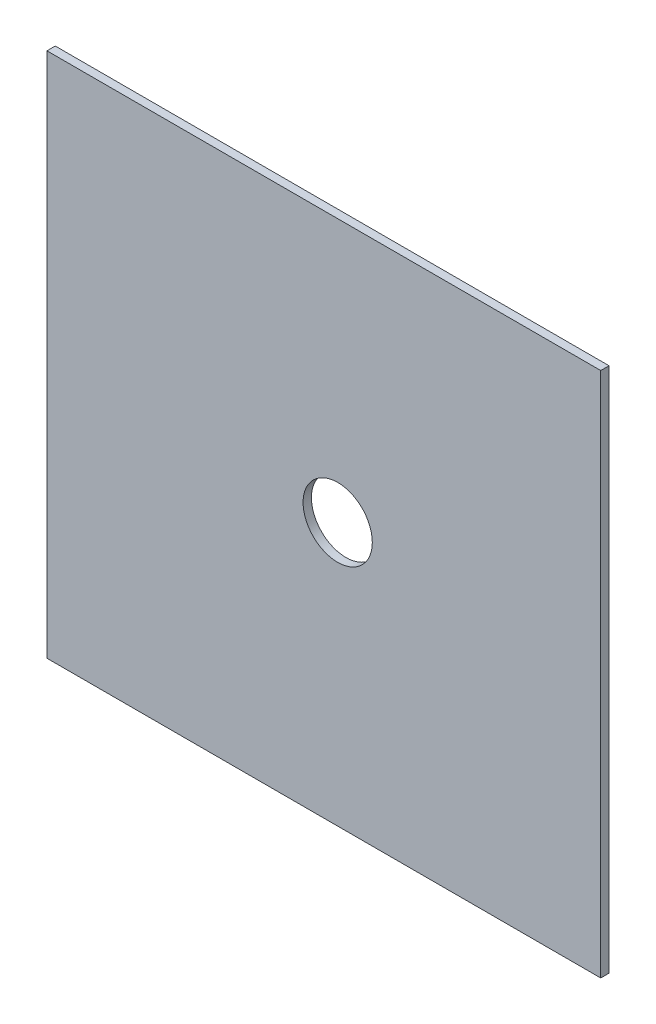
ISO-10303-21;
HEADER;
FILE_DESCRIPTION(('STEP AP214'),'2;1');
FILE_NAME('part.step','',(''),(''),'','','');
FILE_SCHEMA(('AUTOMOTIVE_DESIGN { 1 0 10303 214 1 1 1 1 }'));
ENDSEC;
DATA;
#1=APPLICATION_CONTEXT('core data for automotive mechanical design processes');
#2=APPLICATION_PROTOCOL_DEFINITION('international standard','automotive_design',2000,#1);
#3=PRODUCT_CONTEXT('',#1,'mechanical');
#4=PRODUCT('Part','Part','',(#3));
#5=PRODUCT_RELATED_PRODUCT_CATEGORY('part','',(#4));
#6=PRODUCT_DEFINITION_FORMATION('','',#4);
#7=PRODUCT_DEFINITION_CONTEXT('part definition',#1,'design');
#8=PRODUCT_DEFINITION('design','',#6,#7);
#9=PRODUCT_DEFINITION_SHAPE('','',#8);
#10=(LENGTH_UNIT() NAMED_UNIT(*) SI_UNIT(.MILLI.,.METRE.));
#11=(NAMED_UNIT(*) PLANE_ANGLE_UNIT() SI_UNIT($,.RADIAN.));
#12=(NAMED_UNIT(*) SI_UNIT($,.STERADIAN.) SOLID_ANGLE_UNIT());
#13=UNCERTAINTY_MEASURE_WITH_UNIT(LENGTH_MEASURE(1.E-05),#10,'distance_accuracy_value','');
#14=(GEOMETRIC_REPRESENTATION_CONTEXT(3) GLOBAL_UNCERTAINTY_ASSIGNED_CONTEXT((#13)) GLOBAL_UNIT_ASSIGNED_CONTEXT((#10,
#11,#12)) REPRESENTATION_CONTEXT('',''));
#15=CARTESIAN_POINT('',(0.,0.,0.));
#16=DIRECTION('',(0.,0.,1.));
#17=DIRECTION('',(1.,0.,0.));
#18=AXIS2_PLACEMENT_3D('',#15,#16,#17);
#19=CARTESIAN_POINT('',(100.,-95.,3.));
#20=DIRECTION('',(-1.,0.,0.));
#21=DIRECTION('',(0.,0.,1.));
#22=AXIS2_PLACEMENT_3D('',#19,#20,#21);
#23=PLANE('',#22);
#24=DIRECTION('',(0.,1.,0.));
#25=VECTOR('',#24,1.);
#26=CARTESIAN_POINT('',(100.,-95.,0.));
#27=LINE('',#26,#25);
#28=CARTESIAN_POINT('',(100.,-95.,0.));
#29=VERTEX_POINT('',#28);
#30=CARTESIAN_POINT('',(100.,95.,0.));
#31=VERTEX_POINT('',#30);
#32=EDGE_CURVE('E104',#29,#31,#27,.T.);
#33=ORIENTED_EDGE('',*,*,#32,.T.);
#34=DIRECTION('',(0.,0.,-1.));
#35=VECTOR('',#34,1.);
#36=CARTESIAN_POINT('',(100.,95.,3.));
#37=LINE('',#36,#35);
#38=CARTESIAN_POINT('',(100.,95.,3.));
#39=VERTEX_POINT('',#38);
#40=EDGE_CURVE('E11',#39,#31,#37,.T.);
#41=ORIENTED_EDGE('',*,*,#40,.F.);
#42=DIRECTION('',(0.,1.,0.));
#43=VECTOR('',#42,1.);
#44=CARTESIAN_POINT('',(100.,-95.,3.));
#45=LINE('',#44,#43);
#46=CARTESIAN_POINT('',(100.,-95.,3.));
#47=VERTEX_POINT('',#46);
#48=EDGE_CURVE('E92',#47,#39,#45,.T.);
#49=ORIENTED_EDGE('',*,*,#48,.F.);
#50=DIRECTION('',(0.,0.,-1.));
#51=VECTOR('',#50,1.);
#52=CARTESIAN_POINT('',(100.,-95.,3.));
#53=LINE('',#52,#51);
#54=EDGE_CURVE('E100',#47,#29,#53,.T.);
#55=ORIENTED_EDGE('',*,*,#54,.T.);
#56=EDGE_LOOP('',(#33,#41,#49,#55));
#57=FACE_BOUND('',#56,.T.);
#58=ADVANCED_FACE('F41',(#57),#23,.F.);
#59=CARTESIAN_POINT('',(-100.,95.,3.));
#60=DIRECTION('',(0.,-1.,0.));
#61=DIRECTION('',(0.,0.,-1.));
#62=AXIS2_PLACEMENT_3D('',#59,#60,#61);
#63=PLANE('',#62);
#64=DIRECTION('',(-1.,0.,0.));
#65=VECTOR('',#64,1.);
#66=CARTESIAN_POINT('',(-100.,95.,0.));
#67=LINE('',#66,#65);
#68=CARTESIAN_POINT('',(-100.,95.,0.));
#69=VERTEX_POINT('',#68);
#70=EDGE_CURVE('E96',#31,#69,#67,.T.);
#71=ORIENTED_EDGE('',*,*,#70,.T.);
#72=DIRECTION('',(0.,0.,-1.));
#73=VECTOR('',#72,1.);
#74=CARTESIAN_POINT('',(-100.,95.,3.));
#75=LINE('',#74,#73);
#76=CARTESIAN_POINT('',(-100.,95.,3.));
#77=VERTEX_POINT('',#76);
#78=EDGE_CURVE('E49',#77,#69,#75,.T.);
#79=ORIENTED_EDGE('',*,*,#78,.F.);
#80=DIRECTION('',(-1.,0.,0.));
#81=VECTOR('',#80,1.);
#82=CARTESIAN_POINT('',(-100.,95.,3.));
#83=LINE('',#82,#81);
#84=EDGE_CURVE('E87',#39,#77,#83,.T.);
#85=ORIENTED_EDGE('',*,*,#84,.F.);
#86=ORIENTED_EDGE('',*,*,#40,.T.);
#87=EDGE_LOOP('',(#71,#79,#85,#86));
#88=FACE_BOUND('',#87,.T.);
#89=ADVANCED_FACE('F95',(#88),#63,.F.);
#90=CARTESIAN_POINT('',(-100.,-95.,3.));
#91=DIRECTION('',(1.,0.,0.));
#92=DIRECTION('',(0.,0.,-1.));
#93=AXIS2_PLACEMENT_3D('',#90,#91,#92);
#94=PLANE('',#93);
#95=DIRECTION('',(0.,-1.,0.));
#96=VECTOR('',#95,1.);
#97=CARTESIAN_POINT('',(-100.,-95.,0.));
#98=LINE('',#97,#96);
#99=CARTESIAN_POINT('',(-100.,-95.,0.));
#100=VERTEX_POINT('',#99);
#101=EDGE_CURVE('E74',#69,#100,#98,.T.);
#102=ORIENTED_EDGE('',*,*,#101,.T.);
#103=DIRECTION('',(0.,0.,-1.));
#104=VECTOR('',#103,1.);
#105=CARTESIAN_POINT('',(-100.,-95.,3.));
#106=LINE('',#105,#104);
#107=CARTESIAN_POINT('',(-100.,-95.,3.));
#108=VERTEX_POINT('',#107);
#109=EDGE_CURVE('E97',#108,#100,#106,.T.);
#110=ORIENTED_EDGE('',*,*,#109,.F.);
#111=DIRECTION('',(0.,-1.,0.));
#112=VECTOR('',#111,1.);
#113=CARTESIAN_POINT('',(-100.,-95.,3.));
#114=LINE('',#113,#112);
#115=EDGE_CURVE('E90',#77,#108,#114,.T.);
#116=ORIENTED_EDGE('',*,*,#115,.F.);
#117=ORIENTED_EDGE('',*,*,#78,.T.);
#118=EDGE_LOOP('',(#102,#110,#116,#117));
#119=FACE_BOUND('',#118,.T.);
#120=ADVANCED_FACE('F98',(#119),#94,.F.);
#121=CARTESIAN_POINT('',(-100.,-95.,3.));
#122=DIRECTION('',(0.,1.,0.));
#123=DIRECTION('',(0.,0.,1.));
#124=AXIS2_PLACEMENT_3D('',#121,#122,#123);
#125=PLANE('',#124);
#126=DIRECTION('',(1.,0.,0.));
#127=VECTOR('',#126,1.);
#128=CARTESIAN_POINT('',(-100.,-95.,0.));
#129=LINE('',#128,#127);
#130=EDGE_CURVE('E80',#100,#29,#129,.T.);
#131=ORIENTED_EDGE('',*,*,#130,.T.);
#132=ORIENTED_EDGE('',*,*,#54,.F.);
#133=DIRECTION('',(1.,0.,0.));
#134=VECTOR('',#133,1.);
#135=CARTESIAN_POINT('',(-100.,-95.,3.));
#136=LINE('',#135,#134);
#137=EDGE_CURVE('E57',#108,#47,#136,.T.);
#138=ORIENTED_EDGE('',*,*,#137,.F.);
#139=ORIENTED_EDGE('',*,*,#109,.T.);
#140=EDGE_LOOP('',(#131,#132,#138,#139));
#141=FACE_BOUND('',#140,.T.);
#142=ADVANCED_FACE('F112',(#141),#125,.F.);
#143=CARTESIAN_POINT('',(0.,0.,3.));
#144=DIRECTION('',(0.,0.,-1.));
#145=DIRECTION('',(-1.,0.,0.));
#146=AXIS2_PLACEMENT_3D('',#143,#144,#145);
#147=PLANE('',#146);
#148=CARTESIAN_POINT('',(5.00000000000002,0.,3.));
#149=DIRECTION('',(0.,0.,1.));
#150=DIRECTION('',(1.,0.,0.));
#151=AXIS2_PLACEMENT_3D('',#148,#149,#150);
#152=CIRCLE('',#151,12.5);
#153=CARTESIAN_POINT('',(17.5,0.,3.));
#154=VERTEX_POINT('',#153);
#155=EDGE_CURVE('E118',#154,#154,#152,.T.);
#156=ORIENTED_EDGE('',*,*,#155,.F.);
#157=EDGE_LOOP('',(#156));
#158=FACE_BOUND('',#157,.T.);
#159=ORIENTED_EDGE('',*,*,#48,.T.);
#160=ORIENTED_EDGE('',*,*,#84,.T.);
#161=ORIENTED_EDGE('',*,*,#115,.T.);
#162=ORIENTED_EDGE('',*,*,#137,.T.);
#163=EDGE_LOOP('',(#159,#160,#161,#162));
#164=FACE_BOUND('',#163,.T.);
#165=ADVANCED_FACE('F88',(#158,#164),#147,.F.);
#166=CARTESIAN_POINT('',(0.,0.,0.));
#167=DIRECTION('',(0.,0.,-1.));
#168=DIRECTION('',(-1.,0.,0.));
#169=AXIS2_PLACEMENT_3D('',#166,#167,#168);
#170=PLANE('',#169);
#171=CARTESIAN_POINT('',(5.00000000000002,0.,0.));
#172=DIRECTION('',(0.,0.,1.));
#173=DIRECTION('',(1.,0.,0.));
#174=AXIS2_PLACEMENT_3D('',#171,#172,#173);
#175=CIRCLE('',#174,12.5);
#176=CARTESIAN_POINT('',(17.5,0.,0.));
#177=VERTEX_POINT('',#176);
#178=EDGE_CURVE('E107',#177,#177,#175,.T.);
#179=ORIENTED_EDGE('',*,*,#178,.T.);
#180=EDGE_LOOP('',(#179));
#181=FACE_BOUND('',#180,.T.);
#182=ORIENTED_EDGE('',*,*,#32,.F.);
#183=ORIENTED_EDGE('',*,*,#130,.F.);
#184=ORIENTED_EDGE('',*,*,#101,.F.);
#185=ORIENTED_EDGE('',*,*,#70,.F.);
#186=EDGE_LOOP('',(#182,#183,#184,#185));
#187=FACE_BOUND('',#186,.T.);
#188=ADVANCED_FACE('F115',(#181,#187),#170,.T.);
#189=CARTESIAN_POINT('',(5.00000000000002,0.,0.));
#190=DIRECTION('',(0.,0.,1.));
#191=DIRECTION('',(1.,0.,0.));
#192=AXIS2_PLACEMENT_3D('',#189,#190,#191);
#193=CYLINDRICAL_SURFACE('',#192,12.5);
#194=ORIENTED_EDGE('',*,*,#178,.F.);
#195=EDGE_LOOP('',(#194));
#196=FACE_BOUND('',#195,.T.);
#197=ORIENTED_EDGE('',*,*,#155,.T.);
#198=EDGE_LOOP('',(#197));
#199=FACE_BOUND('',#198,.T.);
#200=ADVANCED_FACE('F125',(#196,#199),#193,.F.);
#201=CLOSED_SHELL('',(#58,#89,#120,#142,#165,#188,#200));
#202=MANIFOLD_SOLID_BREP('B2',#201);
#203=ADVANCED_BREP_SHAPE_REPRESENTATION('',(#18,#202),#14);
#204=SHAPE_DEFINITION_REPRESENTATION(#9,#203);
ENDSEC;
END-ISO-10303-21;
